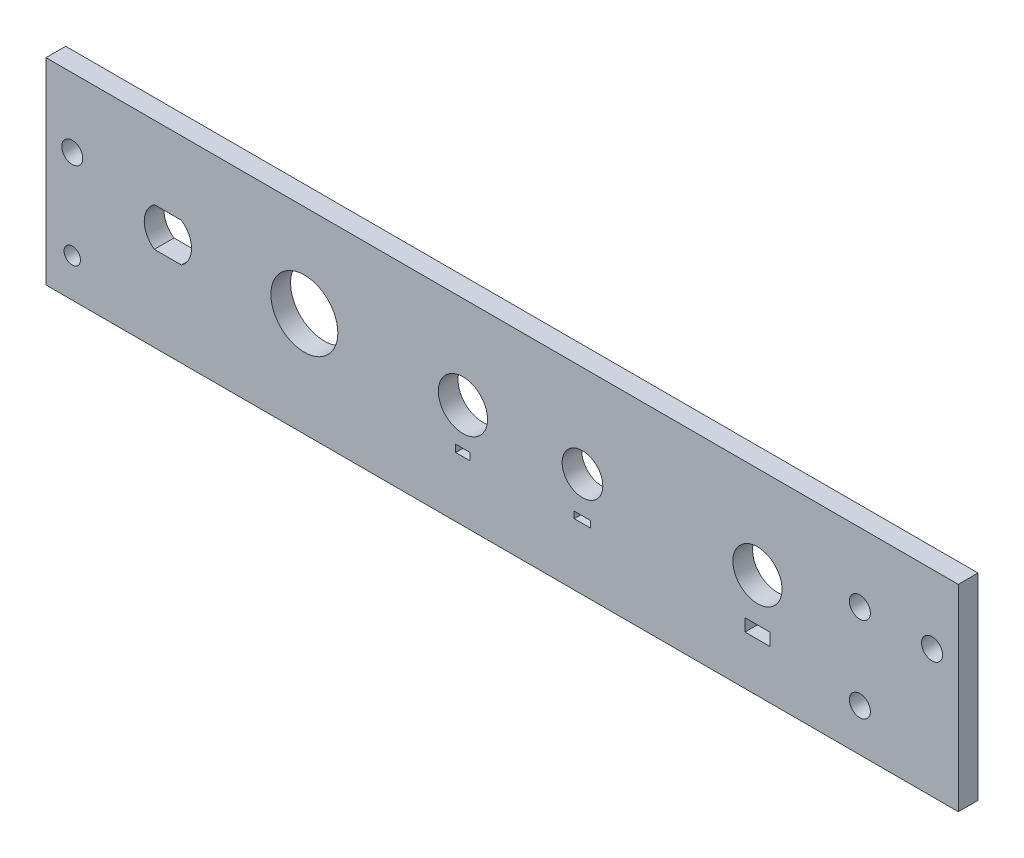
ISO-10303-21;
HEADER;
FILE_DESCRIPTION(('STEP AP214'),'2;1');
FILE_NAME('part.step','',(''),(''),'','','');
FILE_SCHEMA(('AUTOMOTIVE_DESIGN { 1 0 10303 214 1 1 1 1 }'));
ENDSEC;
DATA;
#1=APPLICATION_CONTEXT('core data for automotive mechanical design processes');
#2=APPLICATION_PROTOCOL_DEFINITION('international standard','automotive_design',2000,#1);
#3=PRODUCT_CONTEXT('',#1,'mechanical');
#4=PRODUCT('Part','Part','',(#3));
#5=PRODUCT_RELATED_PRODUCT_CATEGORY('part','',(#4));
#6=PRODUCT_DEFINITION_FORMATION('','',#4);
#7=PRODUCT_DEFINITION_CONTEXT('part definition',#1,'design');
#8=PRODUCT_DEFINITION('design','',#6,#7);
#9=PRODUCT_DEFINITION_SHAPE('','',#8);
#10=(LENGTH_UNIT() NAMED_UNIT(*) SI_UNIT(.MILLI.,.METRE.));
#11=(NAMED_UNIT(*) PLANE_ANGLE_UNIT() SI_UNIT($,.RADIAN.));
#12=(NAMED_UNIT(*) SI_UNIT($,.STERADIAN.) SOLID_ANGLE_UNIT());
#13=UNCERTAINTY_MEASURE_WITH_UNIT(LENGTH_MEASURE(1.E-05),#10,'distance_accuracy_value','');
#14=(GEOMETRIC_REPRESENTATION_CONTEXT(3) GLOBAL_UNCERTAINTY_ASSIGNED_CONTEXT((#13)) GLOBAL_UNIT_ASSIGNED_CONTEXT((#10,
#11,#12)) REPRESENTATION_CONTEXT('',''));
#15=CARTESIAN_POINT('',(0.,0.,0.));
#16=DIRECTION('',(0.,0.,1.));
#17=DIRECTION('',(1.,0.,0.));
#18=AXIS2_PLACEMENT_3D('',#15,#16,#17);
#19=CARTESIAN_POINT('',(0.,0.,3.));
#20=DIRECTION('',(0.,0.,-1.));
#21=DIRECTION('',(-1.,0.,0.));
#22=AXIS2_PLACEMENT_3D('',#19,#20,#21);
#23=PLANE('',#22);
#24=DIRECTION('',(0.,1.,0.));
#25=VECTOR('',#24,1.);
#26=CARTESIAN_POINT('',(82.9808834450306,9.4064580330256,3.));
#27=LINE('',#26,#25);
#28=CARTESIAN_POINT('',(82.9808834450306,9.4064580330256,3.));
#29=VERTEX_POINT('',#28);
#30=CARTESIAN_POINT('',(82.9808834450306,10.4064580330256,3.));
#31=VERTEX_POINT('',#30);
#32=EDGE_CURVE('E222',#29,#31,#27,.T.);
#33=ORIENTED_EDGE('',*,*,#32,.F.);
#34=DIRECTION('',(1.,0.,0.));
#35=VECTOR('',#34,1.);
#36=CARTESIAN_POINT('',(80.4808834450305,9.4064580330256,3.));
#37=LINE('',#36,#35);
#38=CARTESIAN_POINT('',(80.4808834450305,9.4064580330256,3.));
#39=VERTEX_POINT('',#38);
#40=EDGE_CURVE('E230',#39,#29,#37,.T.);
#41=ORIENTED_EDGE('',*,*,#40,.F.);
#42=DIRECTION('',(0.,-1.,0.));
#43=VECTOR('',#42,1.);
#44=CARTESIAN_POINT('',(80.4808834450305,9.4064580330256,3.));
#45=LINE('',#44,#43);
#46=CARTESIAN_POINT('',(80.4808834450305,10.4064580330256,3.));
#47=VERTEX_POINT('',#46);
#48=EDGE_CURVE('E228',#47,#39,#45,.T.);
#49=ORIENTED_EDGE('',*,*,#48,.F.);
#50=DIRECTION('',(-1.,0.,0.));
#51=VECTOR('',#50,1.);
#52=CARTESIAN_POINT('',(80.4808834450305,10.4064580330256,3.));
#53=LINE('',#52,#51);
#54=EDGE_CURVE('E223',#31,#47,#53,.T.);
#55=ORIENTED_EDGE('',*,*,#54,.F.);
#56=EDGE_LOOP('',(#33,#41,#49,#55));
#57=FACE_BOUND('',#56,.T.);
#58=CARTESIAN_POINT('',(135.,19.5,3.));
#59=DIRECTION('',(0.,0.,1.));
#60=DIRECTION('',(1.,0.,0.));
#61=AXIS2_PLACEMENT_3D('',#58,#59,#60);
#62=CIRCLE('',#61,1.59999999999999);
#63=CARTESIAN_POINT('',(136.6,19.5,3.));
#64=VERTEX_POINT('',#63);
#65=EDGE_CURVE('E284',#64,#64,#62,.T.);
#66=ORIENTED_EDGE('',*,*,#65,.F.);
#67=EDGE_LOOP('',(#66));
#68=FACE_BOUND('',#67,.T.);
#69=CARTESIAN_POINT('',(4.,19.5,3.));
#70=DIRECTION('',(0.,0.,1.));
#71=DIRECTION('',(1.,0.,0.));
#72=AXIS2_PLACEMENT_3D('',#69,#70,#71);
#73=CIRCLE('',#72,1.6);
#74=CARTESIAN_POINT('',(5.6,19.5,3.));
#75=VERTEX_POINT('',#74);
#76=EDGE_CURVE('E289',#75,#75,#73,.T.);
#77=ORIENTED_EDGE('',*,*,#76,.F.);
#78=EDGE_LOOP('',(#77));
#79=FACE_BOUND('',#78,.T.);
#80=CARTESIAN_POINT('',(63.5225005719776,15.9064580330256,3.));
#81=DIRECTION('',(0.,0.,1.));
#82=DIRECTION('',(1.,0.,0.));
#83=AXIS2_PLACEMENT_3D('',#80,#81,#82);
#84=CIRCLE('',#83,3.75000000000004);
#85=CARTESIAN_POINT('',(67.2725005719776,15.9064580330256,3.));
#86=VERTEX_POINT('',#85);
#87=EDGE_CURVE('E294',#86,#86,#84,.T.);
#88=ORIENTED_EDGE('',*,*,#87,.F.);
#89=EDGE_LOOP('',(#88));
#90=FACE_BOUND('',#89,.T.);
#91=CARTESIAN_POINT('',(81.7308834450305,15.9064580330256,3.));
#92=DIRECTION('',(0.,0.,1.));
#93=DIRECTION('',(1.,0.,0.));
#94=AXIS2_PLACEMENT_3D('',#91,#92,#93);
#95=CIRCLE('',#94,3.09999999999997);
#96=CARTESIAN_POINT('',(84.8308834450305,15.9064580330256,3.));
#97=VERTEX_POINT('',#96);
#98=EDGE_CURVE('E301',#97,#97,#95,.T.);
#99=ORIENTED_EDGE('',*,*,#98,.F.);
#100=EDGE_LOOP('',(#99));
#101=FACE_BOUND('',#100,.T.);
#102=DIRECTION('',(0.,1.,0.));
#103=VECTOR('',#102,1.);
#104=CARTESIAN_POINT('',(110.299727046977,7.4564580330256,3.));
#105=LINE('',#104,#103);
#106=CARTESIAN_POINT('',(110.299727046977,7.4564580330256,3.));
#107=VERTEX_POINT('',#106);
#108=CARTESIAN_POINT('',(110.299727046977,9.3564580330256,3.));
#109=VERTEX_POINT('',#108);
#110=EDGE_CURVE('E310',#107,#109,#105,.T.);
#111=ORIENTED_EDGE('',*,*,#110,.F.);
#112=DIRECTION('',(1.,0.,0.));
#113=VECTOR('',#112,1.);
#114=CARTESIAN_POINT('',(106.499727046977,7.4564580330256,3.));
#115=LINE('',#114,#113);
#116=CARTESIAN_POINT('',(106.499727046977,7.4564580330256,3.));
#117=VERTEX_POINT('',#116);
#118=EDGE_CURVE('E314',#117,#107,#115,.T.);
#119=ORIENTED_EDGE('',*,*,#118,.F.);
#120=DIRECTION('',(0.,-1.,0.));
#121=VECTOR('',#120,1.);
#122=CARTESIAN_POINT('',(106.499727046977,7.4564580330256,3.));
#123=LINE('',#122,#121);
#124=CARTESIAN_POINT('',(106.499727046977,9.3564580330256,3.));
#125=VERTEX_POINT('',#124);
#126=EDGE_CURVE('E315',#125,#117,#123,.T.);
#127=ORIENTED_EDGE('',*,*,#126,.F.);
#128=DIRECTION('',(-1.,0.,0.));
#129=VECTOR('',#128,1.);
#130=CARTESIAN_POINT('',(106.499727046977,9.3564580330256,3.));
#131=LINE('',#130,#129);
#132=EDGE_CURVE('E307',#109,#125,#131,.T.);
#133=ORIENTED_EDGE('',*,*,#132,.F.);
#134=EDGE_LOOP('',(#111,#119,#127,#133));
#135=FACE_BOUND('',#134,.T.);
#136=DIRECTION('',(0.,-1.,0.));
#137=VECTOR('',#136,1.);
#138=CARTESIAN_POINT('',(0.,0.,3.));
#139=LINE('',#138,#137);
#140=CARTESIAN_POINT('',(0.,30.,3.));
#141=VERTEX_POINT('',#140);
#142=CARTESIAN_POINT('',(0.,0.,3.));
#143=VERTEX_POINT('',#142);
#144=EDGE_CURVE('E341',#141,#143,#139,.T.);
#145=ORIENTED_EDGE('',*,*,#144,.T.);
#146=DIRECTION('',(1.,0.,0.));
#147=VECTOR('',#146,1.);
#148=CARTESIAN_POINT('',(0.,0.,3.));
#149=LINE('',#148,#147);
#150=CARTESIAN_POINT('',(139.,0.,3.));
#151=VERTEX_POINT('',#150);
#152=EDGE_CURVE('E350',#143,#151,#149,.T.);
#153=ORIENTED_EDGE('',*,*,#152,.T.);
#154=DIRECTION('',(0.,1.,0.));
#155=VECTOR('',#154,1.);
#156=CARTESIAN_POINT('',(139.,0.,3.));
#157=LINE('',#156,#155);
#158=CARTESIAN_POINT('',(139.,30.,3.));
#159=VERTEX_POINT('',#158);
#160=EDGE_CURVE('E348',#151,#159,#157,.T.);
#161=ORIENTED_EDGE('',*,*,#160,.T.);
#162=DIRECTION('',(-1.,0.,0.));
#163=VECTOR('',#162,1.);
#164=CARTESIAN_POINT('',(0.,30.,3.));
#165=LINE('',#164,#163);
#166=EDGE_CURVE('E355',#159,#141,#165,.T.);
#167=ORIENTED_EDGE('',*,*,#166,.T.);
#168=EDGE_LOOP('',(#145,#153,#161,#167));
#169=FACE_BOUND('',#168,.T.);
#170=CARTESIAN_POINT('',(39.3612394480737,15.9064580330256,3.));
#171=DIRECTION('',(0.,0.,1.));
#172=DIRECTION('',(1.,0.,0.));
#173=AXIS2_PLACEMENT_3D('',#170,#171,#172);
#174=CIRCLE('',#173,5.1);
#175=CARTESIAN_POINT('',(44.4612394480737,15.9064580330256,3.));
#176=VERTEX_POINT('',#175);
#177=EDGE_CURVE('E336',#176,#176,#174,.T.);
#178=ORIENTED_EDGE('',*,*,#177,.F.);
#179=EDGE_LOOP('',(#178));
#180=FACE_BOUND('',#179,.T.);
#181=DIRECTION('',(0.,1.,0.));
#182=VECTOR('',#181,1.);
#183=CARTESIAN_POINT('',(64.6225005719776,9.1064580330256,3.));
#184=LINE('',#183,#182);
#185=CARTESIAN_POINT('',(64.6225005719776,9.1064580330256,3.));
#186=VERTEX_POINT('',#185);
#187=CARTESIAN_POINT('',(64.6225005719776,10.2064580330256,3.));
#188=VERTEX_POINT('',#187);
#189=EDGE_CURVE('E255',#186,#188,#184,.T.);
#190=ORIENTED_EDGE('',*,*,#189,.F.);
#191=DIRECTION('',(1.,0.,0.));
#192=VECTOR('',#191,1.);
#193=CARTESIAN_POINT('',(62.4225005719776,9.1064580330256,3.));
#194=LINE('',#193,#192);
#195=CARTESIAN_POINT('',(62.4225005719776,9.1064580330256,3.));
#196=VERTEX_POINT('',#195);
#197=EDGE_CURVE('E258',#196,#186,#194,.T.);
#198=ORIENTED_EDGE('',*,*,#197,.F.);
#199=DIRECTION('',(0.,-1.,0.));
#200=VECTOR('',#199,1.);
#201=CARTESIAN_POINT('',(62.4225005719776,9.1064580330256,3.));
#202=LINE('',#201,#200);
#203=CARTESIAN_POINT('',(62.4225005719776,10.2064580330256,3.));
#204=VERTEX_POINT('',#203);
#205=EDGE_CURVE('E260',#204,#196,#202,.T.);
#206=ORIENTED_EDGE('',*,*,#205,.F.);
#207=DIRECTION('',(-1.,0.,0.));
#208=VECTOR('',#207,1.);
#209=CARTESIAN_POINT('',(62.4225005719776,10.2064580330256,3.));
#210=LINE('',#209,#208);
#211=EDGE_CURVE('E251',#188,#204,#210,.T.);
#212=ORIENTED_EDGE('',*,*,#211,.F.);
#213=EDGE_LOOP('',(#190,#198,#206,#212));
#214=FACE_BOUND('',#213,.T.);
#215=CARTESIAN_POINT('',(18.5686517998568,15.9064580330256,3.));
#216=DIRECTION('',(0.,0.,1.));
#217=DIRECTION('',(1.,0.,0.));
#218=AXIS2_PLACEMENT_3D('',#215,#216,#217);
#219=CIRCLE('',#218,3.6);
#220=CARTESIAN_POINT('',(20.6320228280533,12.9564580330257,3.));
#221=VERTEX_POINT('',#220);
#222=CARTESIAN_POINT('',(20.6320228280533,18.8564580330255,3.));
#223=VERTEX_POINT('',#222);
#224=EDGE_CURVE('E185',#221,#223,#219,.T.);
#225=ORIENTED_EDGE('',*,*,#224,.F.);
#226=DIRECTION('',(1.,0.,0.));
#227=VECTOR('',#226,1.);
#228=CARTESIAN_POINT('',(16.5052807716603,12.9564580330257,3.));
#229=LINE('',#228,#227);
#230=CARTESIAN_POINT('',(16.5052807716603,12.9564580330257,3.));
#231=VERTEX_POINT('',#230);
#232=EDGE_CURVE('E201',#231,#221,#229,.T.);
#233=ORIENTED_EDGE('',*,*,#232,.F.);
#234=CARTESIAN_POINT('',(18.5686517998568,15.9064580330256,3.));
#235=DIRECTION('',(0.,0.,1.));
#236=DIRECTION('',(1.,0.,0.));
#237=AXIS2_PLACEMENT_3D('',#234,#235,#236);
#238=CIRCLE('',#237,3.6);
#239=CARTESIAN_POINT('',(16.5052807716603,18.8564580330255,3.));
#240=VERTEX_POINT('',#239);
#241=EDGE_CURVE('E203',#240,#231,#238,.T.);
#242=ORIENTED_EDGE('',*,*,#241,.F.);
#243=DIRECTION('',(-1.,0.,0.));
#244=VECTOR('',#243,1.);
#245=CARTESIAN_POINT('',(20.6320228280533,18.8564580330255,3.));
#246=LINE('',#245,#244);
#247=EDGE_CURVE('E188',#223,#240,#246,.T.);
#248=ORIENTED_EDGE('',*,*,#247,.F.);
#249=EDGE_LOOP('',(#225,#233,#242,#248));
#250=FACE_BOUND('',#249,.T.);
#251=CARTESIAN_POINT('',(124.,19.5,3.));
#252=DIRECTION('',(0.,0.,1.));
#253=DIRECTION('',(1.,0.,0.));
#254=AXIS2_PLACEMENT_3D('',#251,#252,#253);
#255=CIRCLE('',#254,1.6);
#256=CARTESIAN_POINT('',(125.6,19.5,3.));
#257=VERTEX_POINT('',#256);
#258=EDGE_CURVE('E212',#257,#257,#255,.T.);
#259=ORIENTED_EDGE('',*,*,#258,.F.);
#260=EDGE_LOOP('',(#259));
#261=FACE_BOUND('',#260,.T.);
#262=CARTESIAN_POINT('',(108.399727046977,15.9064580330256,3.));
#263=DIRECTION('',(0.,0.,1.));
#264=DIRECTION('',(1.,0.,0.));
#265=AXIS2_PLACEMENT_3D('',#262,#263,#264);
#266=CIRCLE('',#265,3.75000000000001);
#267=CARTESIAN_POINT('',(112.149727046977,15.9064580330256,3.));
#268=VERTEX_POINT('',#267);
#269=EDGE_CURVE('E451',#268,#268,#266,.T.);
#270=ORIENTED_EDGE('',*,*,#269,.F.);
#271=EDGE_LOOP('',(#270));
#272=FACE_BOUND('',#271,.T.);
#273=CARTESIAN_POINT('',(124.,6.5,3.));
#274=DIRECTION('',(0.,0.,1.));
#275=DIRECTION('',(1.,0.,0.));
#276=AXIS2_PLACEMENT_3D('',#273,#274,#275);
#277=CIRCLE('',#276,1.60000000000001);
#278=CARTESIAN_POINT('',(125.6,6.5,3.));
#279=VERTEX_POINT('',#278);
#280=EDGE_CURVE('E446',#279,#279,#277,.T.);
#281=ORIENTED_EDGE('',*,*,#280,.F.);
#282=EDGE_LOOP('',(#281));
#283=FACE_BOUND('',#282,.T.);
#284=CARTESIAN_POINT('',(4.,5.89580856347355,3.));
#285=DIRECTION('',(0.,0.,1.));
#286=DIRECTION('',(1.,0.,0.));
#287=AXIS2_PLACEMENT_3D('',#284,#285,#286);
#288=CIRCLE('',#287,1.25);
#289=CARTESIAN_POINT('',(5.25,5.89580856347355,3.));
#290=VERTEX_POINT('',#289);
#291=EDGE_CURVE('E442',#290,#290,#288,.T.);
#292=ORIENTED_EDGE('',*,*,#291,.F.);
#293=EDGE_LOOP('',(#292));
#294=FACE_BOUND('',#293,.T.);
#295=ADVANCED_FACE('F44',(#57,#68,#79,#90,#101,#135,#169,#180,#214,#250,#261,#272,#283,#294),
#23,.F.);
#296=CARTESIAN_POINT('',(0.,0.,0.));
#297=DIRECTION('',(0.,0.,-1.));
#298=DIRECTION('',(-1.,0.,0.));
#299=AXIS2_PLACEMENT_3D('',#296,#297,#298);
#300=PLANE('',#299);
#301=CARTESIAN_POINT('',(124.,6.5,0.));
#302=DIRECTION('',(0.,0.,1.));
#303=DIRECTION('',(1.,0.,0.));
#304=AXIS2_PLACEMENT_3D('',#301,#302,#303);
#305=CIRCLE('',#304,1.60000000000001);
#306=CARTESIAN_POINT('',(125.6,6.5,0.));
#307=VERTEX_POINT('',#306);
#308=EDGE_CURVE('E447',#307,#307,#305,.T.);
#309=ORIENTED_EDGE('',*,*,#308,.T.);
#310=EDGE_LOOP('',(#309));
#311=FACE_BOUND('',#310,.T.);
#312=CARTESIAN_POINT('',(124.,19.5,0.));
#313=DIRECTION('',(0.,0.,1.));
#314=DIRECTION('',(1.,0.,0.));
#315=AXIS2_PLACEMENT_3D('',#312,#313,#314);
#316=CIRCLE('',#315,1.6);
#317=CARTESIAN_POINT('',(125.6,19.5,0.));
#318=VERTEX_POINT('',#317);
#319=EDGE_CURVE('E460',#318,#318,#316,.T.);
#320=ORIENTED_EDGE('',*,*,#319,.T.);
#321=EDGE_LOOP('',(#320));
#322=FACE_BOUND('',#321,.T.);
#323=CARTESIAN_POINT('',(4.,19.5,0.));
#324=DIRECTION('',(0.,0.,1.));
#325=DIRECTION('',(1.,0.,0.));
#326=AXIS2_PLACEMENT_3D('',#323,#324,#325);
#327=CIRCLE('',#326,1.6);
#328=CARTESIAN_POINT('',(5.6,19.5,0.));
#329=VERTEX_POINT('',#328);
#330=EDGE_CURVE('E287',#329,#329,#327,.T.);
#331=ORIENTED_EDGE('',*,*,#330,.T.);
#332=EDGE_LOOP('',(#331));
#333=FACE_BOUND('',#332,.T.);
#334=CARTESIAN_POINT('',(81.7308834450305,15.9064580330256,0.));
#335=DIRECTION('',(0.,0.,1.));
#336=DIRECTION('',(1.,0.,0.));
#337=AXIS2_PLACEMENT_3D('',#334,#335,#336);
#338=CIRCLE('',#337,3.09999999999997);
#339=CARTESIAN_POINT('',(84.8308834450305,15.9064580330256,0.));
#340=VERTEX_POINT('',#339);
#341=EDGE_CURVE('E296',#340,#340,#338,.T.);
#342=ORIENTED_EDGE('',*,*,#341,.T.);
#343=EDGE_LOOP('',(#342));
#344=FACE_BOUND('',#343,.T.);
#345=DIRECTION('',(0.,-1.,0.));
#346=VECTOR('',#345,1.);
#347=CARTESIAN_POINT('',(0.,0.,0.));
#348=LINE('',#347,#346);
#349=CARTESIAN_POINT('',(0.,30.,0.));
#350=VERTEX_POINT('',#349);
#351=CARTESIAN_POINT('',(0.,0.,0.));
#352=VERTEX_POINT('',#351);
#353=EDGE_CURVE('E342',#350,#352,#348,.T.);
#354=ORIENTED_EDGE('',*,*,#353,.F.);
#355=DIRECTION('',(-1.,0.,0.));
#356=VECTOR('',#355,1.);
#357=CARTESIAN_POINT('',(0.,30.,0.));
#358=LINE('',#357,#356);
#359=CARTESIAN_POINT('',(139.,30.,0.));
#360=VERTEX_POINT('',#359);
#361=EDGE_CURVE('E349',#360,#350,#358,.T.);
#362=ORIENTED_EDGE('',*,*,#361,.F.);
#363=DIRECTION('',(0.,1.,0.));
#364=VECTOR('',#363,1.);
#365=CARTESIAN_POINT('',(139.,0.,0.));
#366=LINE('',#365,#364);
#367=CARTESIAN_POINT('',(139.,0.,0.));
#368=VERTEX_POINT('',#367);
#369=EDGE_CURVE('E360',#368,#360,#366,.T.);
#370=ORIENTED_EDGE('',*,*,#369,.F.);
#371=DIRECTION('',(1.,0.,0.));
#372=VECTOR('',#371,1.);
#373=CARTESIAN_POINT('',(0.,0.,0.));
#374=LINE('',#373,#372);
#375=EDGE_CURVE('E357',#352,#368,#374,.T.);
#376=ORIENTED_EDGE('',*,*,#375,.F.);
#377=EDGE_LOOP('',(#354,#362,#370,#376));
#378=FACE_BOUND('',#377,.T.);
#379=CARTESIAN_POINT('',(39.3612394480737,15.9064580330256,0.));
#380=DIRECTION('',(0.,0.,1.));
#381=DIRECTION('',(1.,0.,0.));
#382=AXIS2_PLACEMENT_3D('',#379,#380,#381);
#383=CIRCLE('',#382,5.1);
#384=CARTESIAN_POINT('',(44.4612394480737,15.9064580330256,0.));
#385=VERTEX_POINT('',#384);
#386=EDGE_CURVE('E340',#385,#385,#383,.T.);
#387=ORIENTED_EDGE('',*,*,#386,.T.);
#388=EDGE_LOOP('',(#387));
#389=FACE_BOUND('',#388,.T.);
#390=DIRECTION('',(1.,0.,0.));
#391=VECTOR('',#390,1.);
#392=CARTESIAN_POINT('',(106.499727046977,7.4564580330256,0.));
#393=LINE('',#392,#391);
#394=CARTESIAN_POINT('',(106.499727046977,7.4564580330256,0.));
#395=VERTEX_POINT('',#394);
#396=CARTESIAN_POINT('',(110.299727046977,7.4564580330256,0.));
#397=VERTEX_POINT('',#396);
#398=EDGE_CURVE('E309',#395,#397,#393,.T.);
#399=ORIENTED_EDGE('',*,*,#398,.T.);
#400=DIRECTION('',(0.,1.,0.));
#401=VECTOR('',#400,1.);
#402=CARTESIAN_POINT('',(110.299727046977,7.4564580330256,0.));
#403=LINE('',#402,#401);
#404=CARTESIAN_POINT('',(110.299727046977,9.3564580330256,0.));
#405=VERTEX_POINT('',#404);
#406=EDGE_CURVE('E302',#397,#405,#403,.T.);
#407=ORIENTED_EDGE('',*,*,#406,.T.);
#408=DIRECTION('',(-1.,0.,0.));
#409=VECTOR('',#408,1.);
#410=CARTESIAN_POINT('',(106.499727046977,9.3564580330256,0.));
#411=LINE('',#410,#409);
#412=CARTESIAN_POINT('',(106.499727046977,9.3564580330256,0.));
#413=VERTEX_POINT('',#412);
#414=EDGE_CURVE('E318',#405,#413,#411,.T.);
#415=ORIENTED_EDGE('',*,*,#414,.T.);
#416=DIRECTION('',(0.,-1.,0.));
#417=VECTOR('',#416,1.);
#418=CARTESIAN_POINT('',(106.499727046977,7.4564580330256,0.));
#419=LINE('',#418,#417);
#420=EDGE_CURVE('E324',#413,#395,#419,.T.);
#421=ORIENTED_EDGE('',*,*,#420,.T.);
#422=EDGE_LOOP('',(#399,#407,#415,#421));
#423=FACE_BOUND('',#422,.T.);
#424=CARTESIAN_POINT('',(63.5225005719776,15.9064580330256,0.));
#425=DIRECTION('',(0.,0.,1.));
#426=DIRECTION('',(1.,0.,0.));
#427=AXIS2_PLACEMENT_3D('',#424,#425,#426);
#428=CIRCLE('',#427,3.75000000000004);
#429=CARTESIAN_POINT('',(67.2725005719776,15.9064580330256,0.));
#430=VERTEX_POINT('',#429);
#431=EDGE_CURVE('E292',#430,#430,#428,.T.);
#432=ORIENTED_EDGE('',*,*,#431,.T.);
#433=EDGE_LOOP('',(#432));
#434=FACE_BOUND('',#433,.T.);
#435=CARTESIAN_POINT('',(135.,19.5,0.));
#436=DIRECTION('',(0.,0.,1.));
#437=DIRECTION('',(1.,0.,0.));
#438=AXIS2_PLACEMENT_3D('',#435,#436,#437);
#439=CIRCLE('',#438,1.59999999999999);
#440=CARTESIAN_POINT('',(136.6,19.5,0.));
#441=VERTEX_POINT('',#440);
#442=EDGE_CURVE('E285',#441,#441,#439,.T.);
#443=ORIENTED_EDGE('',*,*,#442,.T.);
#444=EDGE_LOOP('',(#443));
#445=FACE_BOUND('',#444,.T.);
#446=DIRECTION('',(1.,0.,0.));
#447=VECTOR('',#446,1.);
#448=CARTESIAN_POINT('',(62.4225005719776,9.1064580330256,0.));
#449=LINE('',#448,#447);
#450=CARTESIAN_POINT('',(62.4225005719776,9.1064580330256,0.));
#451=VERTEX_POINT('',#450);
#452=CARTESIAN_POINT('',(64.6225005719776,9.1064580330256,0.));
#453=VERTEX_POINT('',#452);
#454=EDGE_CURVE('E253',#451,#453,#449,.T.);
#455=ORIENTED_EDGE('',*,*,#454,.T.);
#456=DIRECTION('',(0.,1.,0.));
#457=VECTOR('',#456,1.);
#458=CARTESIAN_POINT('',(64.6225005719776,9.1064580330256,0.));
#459=LINE('',#458,#457);
#460=CARTESIAN_POINT('',(64.6225005719776,10.2064580330256,0.));
#461=VERTEX_POINT('',#460);
#462=EDGE_CURVE('E252',#453,#461,#459,.T.);
#463=ORIENTED_EDGE('',*,*,#462,.T.);
#464=DIRECTION('',(-1.,0.,0.));
#465=VECTOR('',#464,1.);
#466=CARTESIAN_POINT('',(62.4225005719776,10.2064580330256,0.));
#467=LINE('',#466,#465);
#468=CARTESIAN_POINT('',(62.4225005719776,10.2064580330256,0.));
#469=VERTEX_POINT('',#468);
#470=EDGE_CURVE('E263',#461,#469,#467,.T.);
#471=ORIENTED_EDGE('',*,*,#470,.T.);
#472=DIRECTION('',(0.,-1.,0.));
#473=VECTOR('',#472,1.);
#474=CARTESIAN_POINT('',(62.4225005719776,9.1064580330256,0.));
#475=LINE('',#474,#473);
#476=EDGE_CURVE('E268',#469,#451,#475,.T.);
#477=ORIENTED_EDGE('',*,*,#476,.T.);
#478=EDGE_LOOP('',(#455,#463,#471,#477));
#479=FACE_BOUND('',#478,.T.);
#480=DIRECTION('',(1.,0.,0.));
#481=VECTOR('',#480,1.);
#482=CARTESIAN_POINT('',(80.4808834450305,9.4064580330256,0.));
#483=LINE('',#482,#481);
#484=CARTESIAN_POINT('',(80.4808834450305,9.4064580330256,0.));
#485=VERTEX_POINT('',#484);
#486=CARTESIAN_POINT('',(82.9808834450306,9.4064580330256,0.));
#487=VERTEX_POINT('',#486);
#488=EDGE_CURVE('E224',#485,#487,#483,.T.);
#489=ORIENTED_EDGE('',*,*,#488,.T.);
#490=DIRECTION('',(0.,1.,0.));
#491=VECTOR('',#490,1.);
#492=CARTESIAN_POINT('',(82.9808834450306,9.4064580330256,0.));
#493=LINE('',#492,#491);
#494=CARTESIAN_POINT('',(82.9808834450306,10.4064580330256,0.));
#495=VERTEX_POINT('',#494);
#496=EDGE_CURVE('E199',#487,#495,#493,.T.);
#497=ORIENTED_EDGE('',*,*,#496,.T.);
#498=DIRECTION('',(-1.,0.,0.));
#499=VECTOR('',#498,1.);
#500=CARTESIAN_POINT('',(80.4808834450305,10.4064580330256,0.));
#501=LINE('',#500,#499);
#502=CARTESIAN_POINT('',(80.4808834450305,10.4064580330256,0.));
#503=VERTEX_POINT('',#502);
#504=EDGE_CURVE('E234',#495,#503,#501,.T.);
#505=ORIENTED_EDGE('',*,*,#504,.T.);
#506=DIRECTION('',(0.,-1.,0.));
#507=VECTOR('',#506,1.);
#508=CARTESIAN_POINT('',(80.4808834450305,9.4064580330256,0.));
#509=LINE('',#508,#507);
#510=EDGE_CURVE('E240',#503,#485,#509,.T.);
#511=ORIENTED_EDGE('',*,*,#510,.T.);
#512=EDGE_LOOP('',(#489,#497,#505,#511));
#513=FACE_BOUND('',#512,.T.);
#514=DIRECTION('',(1.,0.,0.));
#515=VECTOR('',#514,1.);
#516=CARTESIAN_POINT('',(16.5052807716603,12.9564580330257,0.));
#517=LINE('',#516,#515);
#518=CARTESIAN_POINT('',(16.5052807716603,12.9564580330257,0.));
#519=VERTEX_POINT('',#518);
#520=CARTESIAN_POINT('',(20.6320228280533,12.9564580330257,0.));
#521=VERTEX_POINT('',#520);
#522=EDGE_CURVE('E192',#519,#521,#517,.T.);
#523=ORIENTED_EDGE('',*,*,#522,.T.);
#524=CARTESIAN_POINT('',(18.5686517998568,15.9064580330256,0.));
#525=DIRECTION('',(0.,0.,1.));
#526=DIRECTION('',(1.,0.,0.));
#527=AXIS2_PLACEMENT_3D('',#524,#525,#526);
#528=CIRCLE('',#527,3.6);
#529=CARTESIAN_POINT('',(20.6320228280533,18.8564580330255,0.));
#530=VERTEX_POINT('',#529);
#531=EDGE_CURVE('E69',#521,#530,#528,.T.);
#532=ORIENTED_EDGE('',*,*,#531,.T.);
#533=DIRECTION('',(-1.,0.,0.));
#534=VECTOR('',#533,1.);
#535=CARTESIAN_POINT('',(20.6320228280533,18.8564580330255,0.));
#536=LINE('',#535,#534);
#537=CARTESIAN_POINT('',(16.5052807716603,18.8564580330255,0.));
#538=VERTEX_POINT('',#537);
#539=EDGE_CURVE('E200',#530,#538,#536,.T.);
#540=ORIENTED_EDGE('',*,*,#539,.T.);
#541=CARTESIAN_POINT('',(18.5686517998568,15.9064580330256,0.));
#542=DIRECTION('',(0.,0.,1.));
#543=DIRECTION('',(1.,0.,0.));
#544=AXIS2_PLACEMENT_3D('',#541,#542,#543);
#545=CIRCLE('',#544,3.6);
#546=EDGE_CURVE('E214',#538,#519,#545,.T.);
#547=ORIENTED_EDGE('',*,*,#546,.T.);
#548=EDGE_LOOP('',(#523,#532,#540,#547));
#549=FACE_BOUND('',#548,.T.);
#550=CARTESIAN_POINT('',(108.399727046977,15.9064580330256,0.));
#551=DIRECTION('',(0.,0.,1.));
#552=DIRECTION('',(1.,0.,0.));
#553=AXIS2_PLACEMENT_3D('',#550,#551,#552);
#554=CIRCLE('',#553,3.75000000000001);
#555=CARTESIAN_POINT('',(112.149727046977,15.9064580330256,0.));
#556=VERTEX_POINT('',#555);
#557=EDGE_CURVE('E438',#556,#556,#554,.T.);
#558=ORIENTED_EDGE('',*,*,#557,.T.);
#559=EDGE_LOOP('',(#558));
#560=FACE_BOUND('',#559,.T.);
#561=CARTESIAN_POINT('',(4.,5.89580856347355,0.));
#562=DIRECTION('',(0.,0.,1.));
#563=DIRECTION('',(1.,0.,0.));
#564=AXIS2_PLACEMENT_3D('',#561,#562,#563);
#565=CIRCLE('',#564,1.25);
#566=CARTESIAN_POINT('',(5.25,5.89580856347355,0.));
#567=VERTEX_POINT('',#566);
#568=EDGE_CURVE('E441',#567,#567,#565,.T.);
#569=ORIENTED_EDGE('',*,*,#568,.T.);
#570=EDGE_LOOP('',(#569));
#571=FACE_BOUND('',#570,.T.);
#572=ADVANCED_FACE('F380',(#311,#322,#333,#344,#378,#389,#423,#434,#445,#479,#513,#549,#560,
#571),#300,.T.);
#573=CARTESIAN_POINT('',(0.,0.,3.));
#574=DIRECTION('',(1.,0.,0.));
#575=DIRECTION('',(0.,0.,-1.));
#576=AXIS2_PLACEMENT_3D('',#573,#574,#575);
#577=PLANE('',#576);
#578=ORIENTED_EDGE('',*,*,#353,.T.);
#579=DIRECTION('',(0.,0.,-1.));
#580=VECTOR('',#579,1.);
#581=CARTESIAN_POINT('',(0.,0.,3.));
#582=LINE('',#581,#580);
#583=EDGE_CURVE('E11',#143,#352,#582,.T.);
#584=ORIENTED_EDGE('',*,*,#583,.F.);
#585=ORIENTED_EDGE('',*,*,#144,.F.);
#586=DIRECTION('',(0.,0.,-1.));
#587=VECTOR('',#586,1.);
#588=CARTESIAN_POINT('',(0.,30.,3.));
#589=LINE('',#588,#587);
#590=EDGE_CURVE('E354',#141,#350,#589,.T.);
#591=ORIENTED_EDGE('',*,*,#590,.T.);
#592=EDGE_LOOP('',(#578,#584,#585,#591));
#593=FACE_BOUND('',#592,.T.);
#594=ADVANCED_FACE('F50',(#593),#577,.F.);
#595=CARTESIAN_POINT('',(0.,0.,3.));
#596=DIRECTION('',(0.,1.,0.));
#597=DIRECTION('',(0.,0.,1.));
#598=AXIS2_PLACEMENT_3D('',#595,#596,#597);
#599=PLANE('',#598);
#600=ORIENTED_EDGE('',*,*,#375,.T.);
#601=DIRECTION('',(0.,0.,-1.));
#602=VECTOR('',#601,1.);
#603=CARTESIAN_POINT('',(139.,0.,3.));
#604=LINE('',#603,#602);
#605=EDGE_CURVE('E52',#151,#368,#604,.T.);
#606=ORIENTED_EDGE('',*,*,#605,.F.);
#607=ORIENTED_EDGE('',*,*,#152,.F.);
#608=ORIENTED_EDGE('',*,*,#583,.T.);
#609=EDGE_LOOP('',(#600,#606,#607,#608));
#610=FACE_BOUND('',#609,.T.);
#611=ADVANCED_FACE('F389',(#610),#599,.F.);
#612=CARTESIAN_POINT('',(139.,0.,3.));
#613=DIRECTION('',(-1.,0.,0.));
#614=DIRECTION('',(0.,0.,1.));
#615=AXIS2_PLACEMENT_3D('',#612,#613,#614);
#616=PLANE('',#615);
#617=ORIENTED_EDGE('',*,*,#369,.T.);
#618=DIRECTION('',(0.,0.,-1.));
#619=VECTOR('',#618,1.);
#620=CARTESIAN_POINT('',(139.,30.,3.));
#621=LINE('',#620,#619);
#622=EDGE_CURVE('E364',#159,#360,#621,.T.);
#623=ORIENTED_EDGE('',*,*,#622,.F.);
#624=ORIENTED_EDGE('',*,*,#160,.F.);
#625=ORIENTED_EDGE('',*,*,#605,.T.);
#626=EDGE_LOOP('',(#617,#623,#624,#625));
#627=FACE_BOUND('',#626,.T.);
#628=ADVANCED_FACE('F371',(#627),#616,.F.);
#629=CARTESIAN_POINT('',(0.,30.,3.));
#630=DIRECTION('',(0.,-1.,0.));
#631=DIRECTION('',(1.,0.,0.));
#632=AXIS2_PLACEMENT_3D('',#629,#630,#631);
#633=PLANE('',#632);
#634=ORIENTED_EDGE('',*,*,#361,.T.);
#635=ORIENTED_EDGE('',*,*,#590,.F.);
#636=ORIENTED_EDGE('',*,*,#166,.F.);
#637=ORIENTED_EDGE('',*,*,#622,.T.);
#638=EDGE_LOOP('',(#634,#635,#636,#637));
#639=FACE_BOUND('',#638,.T.);
#640=ADVANCED_FACE('F382',(#639),#633,.F.);
#641=CARTESIAN_POINT('',(39.3612394480737,15.9064580330256,3.));
#642=DIRECTION('',(0.,0.,-1.));
#643=DIRECTION('',(-1.,0.,0.));
#644=AXIS2_PLACEMENT_3D('',#641,#642,#643);
#645=CYLINDRICAL_SURFACE('',#644,5.1);
#646=ORIENTED_EDGE('',*,*,#177,.T.);
#647=EDGE_LOOP('',(#646));
#648=FACE_BOUND('',#647,.T.);
#649=ORIENTED_EDGE('',*,*,#386,.F.);
#650=EDGE_LOOP('',(#649));
#651=FACE_BOUND('',#650,.T.);
#652=ADVANCED_FACE('F407',(#648,#651),#645,.F.);
#653=CARTESIAN_POINT('',(110.299727046977,7.4564580330256,3.));
#654=DIRECTION('',(-1.,0.,0.));
#655=DIRECTION('',(0.,0.,1.));
#656=AXIS2_PLACEMENT_3D('',#653,#654,#655);
#657=PLANE('',#656);
#658=ORIENTED_EDGE('',*,*,#406,.F.);
#659=DIRECTION('',(0.,0.,-1.));
#660=VECTOR('',#659,1.);
#661=CARTESIAN_POINT('',(110.299727046977,7.4564580330256,3.));
#662=LINE('',#661,#660);
#663=EDGE_CURVE('E320',#107,#397,#662,.T.);
#664=ORIENTED_EDGE('',*,*,#663,.F.);
#665=ORIENTED_EDGE('',*,*,#110,.T.);
#666=DIRECTION('',(0.,0.,-1.));
#667=VECTOR('',#666,1.);
#668=CARTESIAN_POINT('',(110.299727046977,9.3564580330256,3.));
#669=LINE('',#668,#667);
#670=EDGE_CURVE('E334',#109,#405,#669,.T.);
#671=ORIENTED_EDGE('',*,*,#670,.T.);
#672=EDGE_LOOP('',(#658,#664,#665,#671));
#673=FACE_BOUND('',#672,.T.);
#674=ADVANCED_FACE('F414',(#673),#657,.T.);
#675=CARTESIAN_POINT('',(106.499727046977,9.3564580330256,3.));
#676=DIRECTION('',(0.,-1.,0.));
#677=DIRECTION('',(0.,0.,-1.));
#678=AXIS2_PLACEMENT_3D('',#675,#676,#677);
#679=PLANE('',#678);
#680=ORIENTED_EDGE('',*,*,#414,.F.);
#681=ORIENTED_EDGE('',*,*,#670,.F.);
#682=ORIENTED_EDGE('',*,*,#132,.T.);
#683=DIRECTION('',(0.,0.,-1.));
#684=VECTOR('',#683,1.);
#685=CARTESIAN_POINT('',(106.499727046977,9.3564580330256,3.));
#686=LINE('',#685,#684);
#687=EDGE_CURVE('E335',#125,#413,#686,.T.);
#688=ORIENTED_EDGE('',*,*,#687,.T.);
#689=EDGE_LOOP('',(#680,#681,#682,#688));
#690=FACE_BOUND('',#689,.T.);
#691=ADVANCED_FACE('F418',(#690),#679,.T.);
#692=CARTESIAN_POINT('',(106.499727046977,7.4564580330256,3.));
#693=DIRECTION('',(1.,0.,0.));
#694=DIRECTION('',(0.,0.,-1.));
#695=AXIS2_PLACEMENT_3D('',#692,#693,#694);
#696=PLANE('',#695);
#697=ORIENTED_EDGE('',*,*,#420,.F.);
#698=ORIENTED_EDGE('',*,*,#687,.F.);
#699=ORIENTED_EDGE('',*,*,#126,.T.);
#700=DIRECTION('',(0.,0.,-1.));
#701=VECTOR('',#700,1.);
#702=CARTESIAN_POINT('',(106.499727046977,7.4564580330256,3.));
#703=LINE('',#702,#701);
#704=EDGE_CURVE('E328',#117,#395,#703,.T.);
#705=ORIENTED_EDGE('',*,*,#704,.T.);
#706=EDGE_LOOP('',(#697,#698,#699,#705));
#707=FACE_BOUND('',#706,.T.);
#708=ADVANCED_FACE('F538',(#707),#696,.T.);
#709=CARTESIAN_POINT('',(106.499727046977,7.4564580330256,3.));
#710=DIRECTION('',(0.,1.,0.));
#711=DIRECTION('',(0.,0.,1.));
#712=AXIS2_PLACEMENT_3D('',#709,#710,#711);
#713=PLANE('',#712);
#714=ORIENTED_EDGE('',*,*,#398,.F.);
#715=ORIENTED_EDGE('',*,*,#704,.F.);
#716=ORIENTED_EDGE('',*,*,#118,.T.);
#717=ORIENTED_EDGE('',*,*,#663,.T.);
#718=EDGE_LOOP('',(#714,#715,#716,#717));
#719=FACE_BOUND('',#718,.T.);
#720=ADVANCED_FACE('F537',(#719),#713,.T.);
#721=CARTESIAN_POINT('',(81.7308834450305,15.9064580330256,3.));
#722=DIRECTION('',(0.,0.,-1.));
#723=DIRECTION('',(-1.,0.,0.));
#724=AXIS2_PLACEMENT_3D('',#721,#722,#723);
#725=CYLINDRICAL_SURFACE('',#724,3.09999999999997);
#726=ORIENTED_EDGE('',*,*,#98,.T.);
#727=EDGE_LOOP('',(#726));
#728=FACE_BOUND('',#727,.T.);
#729=ORIENTED_EDGE('',*,*,#341,.F.);
#730=EDGE_LOOP('',(#729));
#731=FACE_BOUND('',#730,.T.);
#732=ADVANCED_FACE('F535',(#728,#731),#725,.F.);
#733=CARTESIAN_POINT('',(63.5225005719776,15.9064580330256,3.));
#734=DIRECTION('',(0.,0.,-1.));
#735=DIRECTION('',(-1.,0.,0.));
#736=AXIS2_PLACEMENT_3D('',#733,#734,#735);
#737=CYLINDRICAL_SURFACE('',#736,3.75000000000004);
#738=ORIENTED_EDGE('',*,*,#87,.T.);
#739=EDGE_LOOP('',(#738));
#740=FACE_BOUND('',#739,.T.);
#741=ORIENTED_EDGE('',*,*,#431,.F.);
#742=EDGE_LOOP('',(#741));
#743=FACE_BOUND('',#742,.T.);
#744=ADVANCED_FACE('F528',(#740,#743),#737,.F.);
#745=CARTESIAN_POINT('',(4.,19.5,3.));
#746=DIRECTION('',(0.,0.,-1.));
#747=DIRECTION('',(-1.,0.,0.));
#748=AXIS2_PLACEMENT_3D('',#745,#746,#747);
#749=CYLINDRICAL_SURFACE('',#748,1.6);
#750=ORIENTED_EDGE('',*,*,#76,.T.);
#751=EDGE_LOOP('',(#750));
#752=FACE_BOUND('',#751,.T.);
#753=ORIENTED_EDGE('',*,*,#330,.F.);
#754=EDGE_LOOP('',(#753));
#755=FACE_BOUND('',#754,.T.);
#756=ADVANCED_FACE('F521',(#752,#755),#749,.F.);
#757=CARTESIAN_POINT('',(135.,19.5,3.));
#758=DIRECTION('',(0.,0.,-1.));
#759=DIRECTION('',(-1.,0.,0.));
#760=AXIS2_PLACEMENT_3D('',#757,#758,#759);
#761=CYLINDRICAL_SURFACE('',#760,1.59999999999999);
#762=ORIENTED_EDGE('',*,*,#65,.T.);
#763=EDGE_LOOP('',(#762));
#764=FACE_BOUND('',#763,.T.);
#765=ORIENTED_EDGE('',*,*,#442,.F.);
#766=EDGE_LOOP('',(#765));
#767=FACE_BOUND('',#766,.T.);
#768=ADVANCED_FACE('F518',(#764,#767),#761,.F.);
#769=CARTESIAN_POINT('',(64.6225005719776,9.1064580330256,3.));
#770=DIRECTION('',(-1.,0.,0.));
#771=DIRECTION('',(0.,0.,1.));
#772=AXIS2_PLACEMENT_3D('',#769,#770,#771);
#773=PLANE('',#772);
#774=ORIENTED_EDGE('',*,*,#462,.F.);
#775=DIRECTION('',(0.,0.,-1.));
#776=VECTOR('',#775,1.);
#777=CARTESIAN_POINT('',(64.6225005719776,9.1064580330256,3.));
#778=LINE('',#777,#776);
#779=EDGE_CURVE('E265',#186,#453,#778,.T.);
#780=ORIENTED_EDGE('',*,*,#779,.F.);
#781=ORIENTED_EDGE('',*,*,#189,.T.);
#782=DIRECTION('',(0.,0.,-1.));
#783=VECTOR('',#782,1.);
#784=CARTESIAN_POINT('',(64.6225005719776,10.2064580330256,3.));
#785=LINE('',#784,#783);
#786=EDGE_CURVE('E276',#188,#461,#785,.T.);
#787=ORIENTED_EDGE('',*,*,#786,.T.);
#788=EDGE_LOOP('',(#774,#780,#781,#787));
#789=FACE_BOUND('',#788,.T.);
#790=ADVANCED_FACE('F517',(#789),#773,.T.);
#791=CARTESIAN_POINT('',(62.4225005719776,10.2064580330256,3.));
#792=DIRECTION('',(0.,-1.,0.));
#793=DIRECTION('',(0.,0.,-1.));
#794=AXIS2_PLACEMENT_3D('',#791,#792,#793);
#795=PLANE('',#794);
#796=ORIENTED_EDGE('',*,*,#470,.F.);
#797=ORIENTED_EDGE('',*,*,#786,.F.);
#798=ORIENTED_EDGE('',*,*,#211,.T.);
#799=DIRECTION('',(0.,0.,-1.));
#800=VECTOR('',#799,1.);
#801=CARTESIAN_POINT('',(62.4225005719776,10.2064580330256,3.));
#802=LINE('',#801,#800);
#803=EDGE_CURVE('E280',#204,#469,#802,.T.);
#804=ORIENTED_EDGE('',*,*,#803,.T.);
#805=EDGE_LOOP('',(#796,#797,#798,#804));
#806=FACE_BOUND('',#805,.T.);
#807=ADVANCED_FACE('F515',(#806),#795,.T.);
#808=CARTESIAN_POINT('',(62.4225005719776,9.1064580330256,3.));
#809=DIRECTION('',(1.,0.,0.));
#810=DIRECTION('',(0.,0.,-1.));
#811=AXIS2_PLACEMENT_3D('',#808,#809,#810);
#812=PLANE('',#811);
#813=ORIENTED_EDGE('',*,*,#476,.F.);
#814=ORIENTED_EDGE('',*,*,#803,.F.);
#815=ORIENTED_EDGE('',*,*,#205,.T.);
#816=DIRECTION('',(0.,0.,-1.));
#817=VECTOR('',#816,1.);
#818=CARTESIAN_POINT('',(62.4225005719776,9.1064580330256,3.));
#819=LINE('',#818,#817);
#820=EDGE_CURVE('E273',#196,#451,#819,.T.);
#821=ORIENTED_EDGE('',*,*,#820,.T.);
#822=EDGE_LOOP('',(#813,#814,#815,#821));
#823=FACE_BOUND('',#822,.T.);
#824=ADVANCED_FACE('F507',(#823),#812,.T.);
#825=CARTESIAN_POINT('',(62.4225005719776,9.1064580330256,3.));
#826=DIRECTION('',(0.,1.,0.));
#827=DIRECTION('',(0.,0.,1.));
#828=AXIS2_PLACEMENT_3D('',#825,#826,#827);
#829=PLANE('',#828);
#830=ORIENTED_EDGE('',*,*,#454,.F.);
#831=ORIENTED_EDGE('',*,*,#820,.F.);
#832=ORIENTED_EDGE('',*,*,#197,.T.);
#833=ORIENTED_EDGE('',*,*,#779,.T.);
#834=EDGE_LOOP('',(#830,#831,#832,#833));
#835=FACE_BOUND('',#834,.T.);
#836=ADVANCED_FACE('F502',(#835),#829,.T.);
#837=CARTESIAN_POINT('',(82.9808834450306,9.4064580330256,3.));
#838=DIRECTION('',(-1.,0.,0.));
#839=DIRECTION('',(0.,0.,1.));
#840=AXIS2_PLACEMENT_3D('',#837,#838,#839);
#841=PLANE('',#840);
#842=ORIENTED_EDGE('',*,*,#496,.F.);
#843=DIRECTION('',(0.,0.,-1.));
#844=VECTOR('',#843,1.);
#845=CARTESIAN_POINT('',(82.9808834450306,9.4064580330256,3.));
#846=LINE('',#845,#844);
#847=EDGE_CURVE('E233',#29,#487,#846,.T.);
#848=ORIENTED_EDGE('',*,*,#847,.F.);
#849=ORIENTED_EDGE('',*,*,#32,.T.);
#850=DIRECTION('',(0.,0.,-1.));
#851=VECTOR('',#850,1.);
#852=CARTESIAN_POINT('',(82.9808834450306,10.4064580330256,3.));
#853=LINE('',#852,#851);
#854=EDGE_CURVE('E247',#31,#495,#853,.T.);
#855=ORIENTED_EDGE('',*,*,#854,.T.);
#856=EDGE_LOOP('',(#842,#848,#849,#855));
#857=FACE_BOUND('',#856,.T.);
#858=ADVANCED_FACE('F499',(#857),#841,.T.);
#859=CARTESIAN_POINT('',(80.4808834450305,10.4064580330256,3.));
#860=DIRECTION('',(0.,-1.,0.));
#861=DIRECTION('',(1.,0.,0.));
#862=AXIS2_PLACEMENT_3D('',#859,#860,#861);
#863=PLANE('',#862);
#864=ORIENTED_EDGE('',*,*,#504,.F.);
#865=ORIENTED_EDGE('',*,*,#854,.F.);
#866=ORIENTED_EDGE('',*,*,#54,.T.);
#867=DIRECTION('',(0.,0.,-1.));
#868=VECTOR('',#867,1.);
#869=CARTESIAN_POINT('',(80.4808834450305,10.4064580330256,3.));
#870=LINE('',#869,#868);
#871=EDGE_CURVE('E246',#47,#503,#870,.T.);
#872=ORIENTED_EDGE('',*,*,#871,.T.);
#873=EDGE_LOOP('',(#864,#865,#866,#872));
#874=FACE_BOUND('',#873,.T.);
#875=ADVANCED_FACE('F496',(#874),#863,.T.);
#876=CARTESIAN_POINT('',(80.4808834450305,9.4064580330256,3.));
#877=DIRECTION('',(1.,0.,0.));
#878=DIRECTION('',(0.,0.,-1.));
#879=AXIS2_PLACEMENT_3D('',#876,#877,#878);
#880=PLANE('',#879);
#881=ORIENTED_EDGE('',*,*,#510,.F.);
#882=ORIENTED_EDGE('',*,*,#871,.F.);
#883=ORIENTED_EDGE('',*,*,#48,.T.);
#884=DIRECTION('',(0.,0.,-1.));
#885=VECTOR('',#884,1.);
#886=CARTESIAN_POINT('',(80.4808834450305,9.4064580330256,3.));
#887=LINE('',#886,#885);
#888=EDGE_CURVE('E242',#39,#485,#887,.T.);
#889=ORIENTED_EDGE('',*,*,#888,.T.);
#890=EDGE_LOOP('',(#881,#882,#883,#889));
#891=FACE_BOUND('',#890,.T.);
#892=ADVANCED_FACE('F495',(#891),#880,.T.);
#893=CARTESIAN_POINT('',(80.4808834450305,9.4064580330256,3.));
#894=DIRECTION('',(0.,1.,0.));
#895=DIRECTION('',(0.,0.,1.));
#896=AXIS2_PLACEMENT_3D('',#893,#894,#895);
#897=PLANE('',#896);
#898=ORIENTED_EDGE('',*,*,#488,.F.);
#899=ORIENTED_EDGE('',*,*,#888,.F.);
#900=ORIENTED_EDGE('',*,*,#40,.T.);
#901=ORIENTED_EDGE('',*,*,#847,.T.);
#902=EDGE_LOOP('',(#898,#899,#900,#901));
#903=FACE_BOUND('',#902,.T.);
#904=ADVANCED_FACE('F490',(#903),#897,.T.);
#905=CARTESIAN_POINT('',(18.5686517998568,15.9064580330256,3.));
#906=DIRECTION('',(0.,0.,-1.));
#907=DIRECTION('',(-1.,0.,0.));
#908=AXIS2_PLACEMENT_3D('',#905,#906,#907);
#909=CYLINDRICAL_SURFACE('',#908,3.6);
#910=ORIENTED_EDGE('',*,*,#531,.F.);
#911=DIRECTION('',(0.,0.,-1.));
#912=VECTOR('',#911,1.);
#913=CARTESIAN_POINT('',(20.6320228280533,12.9564580330257,3.));
#914=LINE('',#913,#912);
#915=EDGE_CURVE('E187',#221,#521,#914,.T.);
#916=ORIENTED_EDGE('',*,*,#915,.F.);
#917=ORIENTED_EDGE('',*,*,#224,.T.);
#918=DIRECTION('',(0.,0.,-1.));
#919=VECTOR('',#918,1.);
#920=CARTESIAN_POINT('',(20.6320228280533,18.8564580330255,3.));
#921=LINE('',#920,#919);
#922=EDGE_CURVE('E184',#223,#530,#921,.T.);
#923=ORIENTED_EDGE('',*,*,#922,.T.);
#924=EDGE_LOOP('',(#910,#916,#917,#923));
#925=FACE_BOUND('',#924,.T.);
#926=ADVANCED_FACE('F183',(#925),#909,.F.);
#927=CARTESIAN_POINT('',(20.6320228280533,18.8564580330255,3.));
#928=DIRECTION('',(0.,-1.,0.));
#929=DIRECTION('',(0.,0.,-1.));
#930=AXIS2_PLACEMENT_3D('',#927,#928,#929);
#931=PLANE('',#930);
#932=ORIENTED_EDGE('',*,*,#539,.F.);
#933=ORIENTED_EDGE('',*,*,#922,.F.);
#934=ORIENTED_EDGE('',*,*,#247,.T.);
#935=DIRECTION('',(0.,0.,-1.));
#936=VECTOR('',#935,1.);
#937=CARTESIAN_POINT('',(16.5052807716603,18.8564580330255,3.));
#938=LINE('',#937,#936);
#939=EDGE_CURVE('E196',#240,#538,#938,.T.);
#940=ORIENTED_EDGE('',*,*,#939,.T.);
#941=EDGE_LOOP('',(#932,#933,#934,#940));
#942=FACE_BOUND('',#941,.T.);
#943=ADVANCED_FACE('F191',(#942),#931,.T.);
#944=CARTESIAN_POINT('',(18.5686517998568,15.9064580330256,3.));
#945=DIRECTION('',(0.,0.,-1.));
#946=DIRECTION('',(-1.,0.,0.));
#947=AXIS2_PLACEMENT_3D('',#944,#945,#946);
#948=CYLINDRICAL_SURFACE('',#947,3.6);
#949=ORIENTED_EDGE('',*,*,#546,.F.);
#950=ORIENTED_EDGE('',*,*,#939,.F.);
#951=ORIENTED_EDGE('',*,*,#241,.T.);
#952=DIRECTION('',(0.,0.,-1.));
#953=VECTOR('',#952,1.);
#954=CARTESIAN_POINT('',(16.5052807716603,12.9564580330257,3.));
#955=LINE('',#954,#953);
#956=EDGE_CURVE('E58',#231,#519,#955,.T.);
#957=ORIENTED_EDGE('',*,*,#956,.T.);
#958=EDGE_LOOP('',(#949,#950,#951,#957));
#959=FACE_BOUND('',#958,.T.);
#960=ADVANCED_FACE('F479',(#959),#948,.F.);
#961=CARTESIAN_POINT('',(16.5052807716603,12.9564580330257,3.));
#962=DIRECTION('',(0.,1.,0.));
#963=DIRECTION('',(0.,0.,1.));
#964=AXIS2_PLACEMENT_3D('',#961,#962,#963);
#965=PLANE('',#964);
#966=ORIENTED_EDGE('',*,*,#522,.F.);
#967=ORIENTED_EDGE('',*,*,#956,.F.);
#968=ORIENTED_EDGE('',*,*,#232,.T.);
#969=ORIENTED_EDGE('',*,*,#915,.T.);
#970=EDGE_LOOP('',(#966,#967,#968,#969));
#971=FACE_BOUND('',#970,.T.);
#972=ADVANCED_FACE('F466',(#971),#965,.T.);
#973=CARTESIAN_POINT('',(124.,19.5,3.));
#974=DIRECTION('',(0.,0.,-1.));
#975=DIRECTION('',(-1.,0.,0.));
#976=AXIS2_PLACEMENT_3D('',#973,#974,#975);
#977=CYLINDRICAL_SURFACE('',#976,1.6);
#978=ORIENTED_EDGE('',*,*,#258,.T.);
#979=EDGE_LOOP('',(#978));
#980=FACE_BOUND('',#979,.T.);
#981=ORIENTED_EDGE('',*,*,#319,.F.);
#982=EDGE_LOOP('',(#981));
#983=FACE_BOUND('',#982,.T.);
#984=ADVANCED_FACE('F461',(#980,#983),#977,.F.);
#985=CARTESIAN_POINT('',(108.399727046977,15.9064580330256,3.));
#986=DIRECTION('',(0.,0.,-1.));
#987=DIRECTION('',(-1.,0.,0.));
#988=AXIS2_PLACEMENT_3D('',#985,#986,#987);
#989=CYLINDRICAL_SURFACE('',#988,3.75000000000001);
#990=ORIENTED_EDGE('',*,*,#269,.T.);
#991=EDGE_LOOP('',(#990));
#992=FACE_BOUND('',#991,.T.);
#993=ORIENTED_EDGE('',*,*,#557,.F.);
#994=EDGE_LOOP('',(#993));
#995=FACE_BOUND('',#994,.T.);
#996=ADVANCED_FACE('F470',(#992,#995),#989,.F.);
#997=CARTESIAN_POINT('',(124.,6.5,3.));
#998=DIRECTION('',(0.,0.,-1.));
#999=DIRECTION('',(-1.,0.,0.));
#1000=AXIS2_PLACEMENT_3D('',#997,#998,#999);
#1001=CYLINDRICAL_SURFACE('',#1000,1.60000000000001);
#1002=ORIENTED_EDGE('',*,*,#280,.T.);
#1003=EDGE_LOOP('',(#1002));
#1004=FACE_BOUND('',#1003,.T.);
#1005=ORIENTED_EDGE('',*,*,#308,.F.);
#1006=EDGE_LOOP('',(#1005));
#1007=FACE_BOUND('',#1006,.T.);
#1008=ADVANCED_FACE('F473',(#1004,#1007),#1001,.F.);
#1009=CARTESIAN_POINT('',(4.,5.89580856347355,3.));
#1010=DIRECTION('',(0.,0.,-1.));
#1011=DIRECTION('',(-1.,0.,0.));
#1012=AXIS2_PLACEMENT_3D('',#1009,#1010,#1011);
#1013=CYLINDRICAL_SURFACE('',#1012,1.25);
#1014=ORIENTED_EDGE('',*,*,#291,.T.);
#1015=EDGE_LOOP('',(#1014));
#1016=FACE_BOUND('',#1015,.T.);
#1017=ORIENTED_EDGE('',*,*,#568,.F.);
#1018=EDGE_LOOP('',(#1017));
#1019=FACE_BOUND('',#1018,.T.);
#1020=ADVANCED_FACE('F652',(#1016,#1019),#1013,.F.);
#1021=CLOSED_SHELL('',(#295,#572,#594,#611,#628,#640,#652,#674,#691,#708,#720,#732,#744,#756,
#768,#790,#807,#824,#836,#858,#875,#892,#904,#926,#943,#960,#972,#984,#996,#1008,#1020));
#1022=MANIFOLD_SOLID_BREP('B2',#1021);
#1023=ADVANCED_BREP_SHAPE_REPRESENTATION('',(#18,#1022),#14);
#1024=SHAPE_DEFINITION_REPRESENTATION(#9,#1023);
ENDSEC;
END-ISO-10303-21;
